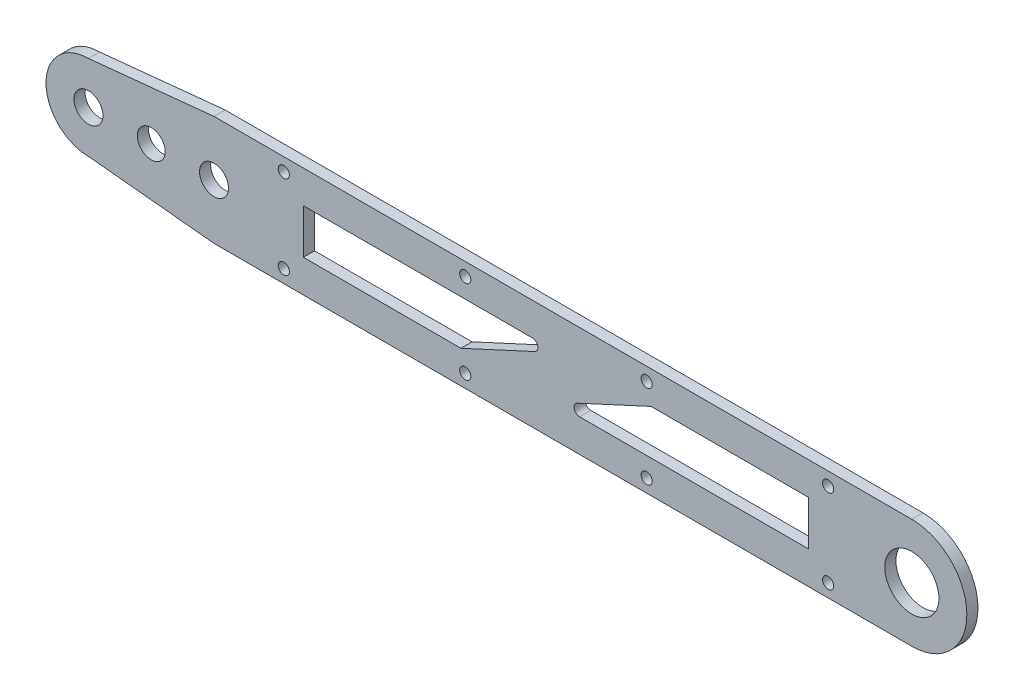
ISO-10303-21;
HEADER;
FILE_DESCRIPTION(('STEP AP214'),'2;1');
FILE_NAME('part.step','',(''),(''),'','','');
FILE_SCHEMA(('AUTOMOTIVE_DESIGN { 1 0 10303 214 1 1 1 1 }'));
ENDSEC;
DATA;
#1=APPLICATION_CONTEXT('core data for automotive mechanical design processes');
#2=APPLICATION_PROTOCOL_DEFINITION('international standard','automotive_design',2000,#1);
#3=PRODUCT_CONTEXT('',#1,'mechanical');
#4=PRODUCT('Part','Part','',(#3));
#5=PRODUCT_RELATED_PRODUCT_CATEGORY('part','',(#4));
#6=PRODUCT_DEFINITION_FORMATION('','',#4);
#7=PRODUCT_DEFINITION_CONTEXT('part definition',#1,'design');
#8=PRODUCT_DEFINITION('design','',#6,#7);
#9=PRODUCT_DEFINITION_SHAPE('','',#8);
#10=(LENGTH_UNIT() NAMED_UNIT(*) SI_UNIT(.MILLI.,.METRE.));
#11=(NAMED_UNIT(*) PLANE_ANGLE_UNIT() SI_UNIT($,.RADIAN.));
#12=(NAMED_UNIT(*) SI_UNIT($,.STERADIAN.) SOLID_ANGLE_UNIT());
#13=UNCERTAINTY_MEASURE_WITH_UNIT(LENGTH_MEASURE(1.E-05),#10,'distance_accuracy_value','');
#14=(GEOMETRIC_REPRESENTATION_CONTEXT(3) GLOBAL_UNCERTAINTY_ASSIGNED_CONTEXT((#13)) GLOBAL_UNIT_ASSIGNED_CONTEXT((#10,
#11,#12)) REPRESENTATION_CONTEXT('',''));
#15=CARTESIAN_POINT('',(0.,0.,0.));
#16=DIRECTION('',(0.,0.,1.));
#17=DIRECTION('',(1.,0.,0.));
#18=AXIS2_PLACEMENT_3D('',#15,#16,#17);
#19=CARTESIAN_POINT('',(-45.,0.,4.));
#20=DIRECTION('',(0.,0.,-1.));
#21=DIRECTION('',(-1.,0.,0.));
#22=AXIS2_PLACEMENT_3D('',#19,#20,#21);
#23=PLANE('',#22);
#24=DIRECTION('',(1.,0.,0.));
#25=VECTOR('',#24,1.);
#26=CARTESIAN_POINT('',(213.,-8.,4.));
#27=LINE('',#26,#25);
#28=CARTESIAN_POINT('',(130.976731594915,-8.,4.));
#29=VERTEX_POINT('',#28);
#30=CARTESIAN_POINT('',(213.,-8.,4.));
#31=VERTEX_POINT('',#30);
#32=EDGE_CURVE('E170',#29,#31,#27,.T.);
#33=ORIENTED_EDGE('',*,*,#32,.F.);
#34=CARTESIAN_POINT('',(130.976731594915,-6.,4.));
#35=DIRECTION('',(0.,0.,1.));
#36=DIRECTION('',(-1.,0.,0.));
#37=AXIS2_PLACEMENT_3D('',#34,#35,#36);
#38=CIRCLE('',#37,2.);
#39=CARTESIAN_POINT('',(130.138615239991,-4.18408123099903,4.));
#40=VERTEX_POINT('',#39);
#41=EDGE_CURVE('E55',#40,#29,#38,.T.);
#42=ORIENTED_EDGE('',*,*,#41,.F.);
#43=DIRECTION('',(-0.907959384500451,-0.419058177461749,0.));
#44=VECTOR('',#43,1.);
#45=CARTESIAN_POINT('',(130.138615239991,-4.18408123099903,4.));
#46=LINE('',#45,#44);
#47=CARTESIAN_POINT('',(156.537457907156,8.,4.));
#48=VERTEX_POINT('',#47);
#49=EDGE_CURVE('E182',#48,#40,#46,.T.);
#50=ORIENTED_EDGE('',*,*,#49,.F.);
#51=DIRECTION('',(-1.,0.,0.));
#52=VECTOR('',#51,1.);
#53=CARTESIAN_POINT('',(156.537457907156,8.,4.));
#54=LINE('',#53,#52);
#55=CARTESIAN_POINT('',(213.,8.,4.));
#56=VERTEX_POINT('',#55);
#57=EDGE_CURVE('E178',#56,#48,#54,.T.);
#58=ORIENTED_EDGE('',*,*,#57,.F.);
#59=DIRECTION('',(0.,1.,0.));
#60=VECTOR('',#59,1.);
#61=CARTESIAN_POINT('',(213.,8.,4.));
#62=LINE('',#61,#60);
#63=EDGE_CURVE('E159',#31,#56,#62,.T.);
#64=ORIENTED_EDGE('',*,*,#63,.F.);
#65=EDGE_LOOP('',(#33,#42,#50,#58,#64));
#66=FACE_BOUND('',#65,.T.);
#67=DIRECTION('',(0.,-1.,0.));
#68=VECTOR('',#67,1.);
#69=CARTESIAN_POINT('',(32.,8.,4.));
#70=LINE('',#69,#68);
#71=CARTESIAN_POINT('',(32.,8.,4.));
#72=VERTEX_POINT('',#71);
#73=CARTESIAN_POINT('',(32.,-8.,4.));
#74=VERTEX_POINT('',#73);
#75=EDGE_CURVE('E202',#72,#74,#70,.T.);
#76=ORIENTED_EDGE('',*,*,#75,.F.);
#77=DIRECTION('',(-1.,0.,0.));
#78=VECTOR('',#77,1.);
#79=CARTESIAN_POINT('',(114.023268405085,8.,4.));
#80=LINE('',#79,#78);
#81=CARTESIAN_POINT('',(114.023268405085,8.,4.));
#82=VERTEX_POINT('',#81);
#83=EDGE_CURVE('E63',#82,#72,#80,.T.);
#84=ORIENTED_EDGE('',*,*,#83,.F.);
#85=CARTESIAN_POINT('',(114.023268405086,6.,4.));
#86=DIRECTION('',(0.,0.,1.));
#87=DIRECTION('',(1.,0.,0.));
#88=AXIS2_PLACEMENT_3D('',#85,#86,#87);
#89=CIRCLE('',#88,2.);
#90=CARTESIAN_POINT('',(114.861384760009,4.18408123099903,4.));
#91=VERTEX_POINT('',#90);
#92=EDGE_CURVE('E215',#91,#82,#89,.T.);
#93=ORIENTED_EDGE('',*,*,#92,.F.);
#94=DIRECTION('',(0.907959384500451,0.419058177461749,0.));
#95=VECTOR('',#94,1.);
#96=CARTESIAN_POINT('',(88.4625420928446,-8.,4.));
#97=LINE('',#96,#95);
#98=CARTESIAN_POINT('',(88.4625420928446,-8.,4.));
#99=VERTEX_POINT('',#98);
#100=EDGE_CURVE('E211',#99,#91,#97,.T.);
#101=ORIENTED_EDGE('',*,*,#100,.F.);
#102=DIRECTION('',(1.,0.,0.));
#103=VECTOR('',#102,1.);
#104=CARTESIAN_POINT('',(32.,-8.,4.));
#105=LINE('',#104,#103);
#106=EDGE_CURVE('E207',#74,#99,#105,.T.);
#107=ORIENTED_EDGE('',*,*,#106,.F.);
#108=EDGE_LOOP('',(#76,#84,#93,#101,#107));
#109=FACE_BOUND('',#108,.T.);
#110=CARTESIAN_POINT('',(-22.5,0.,4.));
#111=DIRECTION('',(0.,0.,1.));
#112=DIRECTION('',(1.,0.,0.));
#113=AXIS2_PLACEMENT_3D('',#110,#111,#112);
#114=CIRCLE('',#113,5.);
#115=CARTESIAN_POINT('',(-17.5,0.,4.));
#116=VERTEX_POINT('',#115);
#117=EDGE_CURVE('E203',#116,#116,#114,.T.);
#118=ORIENTED_EDGE('',*,*,#117,.F.);
#119=EDGE_LOOP('',(#118));
#120=FACE_BOUND('',#119,.T.);
#121=CARTESIAN_POINT('',(90.0000000000003,-15.,4.));
#122=DIRECTION('',(0.,0.,1.));
#123=DIRECTION('',(1.,0.,0.));
#124=AXIS2_PLACEMENT_3D('',#121,#122,#123);
#125=CIRCLE('',#124,2.);
#126=CARTESIAN_POINT('',(92.0000000000003,-15.,4.));
#127=VERTEX_POINT('',#126);
#128=EDGE_CURVE('E241',#127,#127,#125,.T.);
#129=ORIENTED_EDGE('',*,*,#128,.F.);
#130=EDGE_LOOP('',(#129));
#131=FACE_BOUND('',#130,.T.);
#132=CARTESIAN_POINT('',(220.,15.,4.));
#133=DIRECTION('',(0.,0.,1.));
#134=DIRECTION('',(1.,0.,0.));
#135=AXIS2_PLACEMENT_3D('',#132,#133,#134);
#136=CIRCLE('',#135,2.);
#137=CARTESIAN_POINT('',(222.,15.,4.));
#138=VERTEX_POINT('',#137);
#139=EDGE_CURVE('E250',#138,#138,#136,.T.);
#140=ORIENTED_EDGE('',*,*,#139,.F.);
#141=EDGE_LOOP('',(#140));
#142=FACE_BOUND('',#141,.T.);
#143=CARTESIAN_POINT('',(155.,15.,4.));
#144=DIRECTION('',(0.,0.,1.));
#145=DIRECTION('',(1.,0.,0.));
#146=AXIS2_PLACEMENT_3D('',#143,#144,#145);
#147=CIRCLE('',#146,2.);
#148=CARTESIAN_POINT('',(157.,15.,4.));
#149=VERTEX_POINT('',#148);
#150=EDGE_CURVE('E254',#149,#149,#147,.T.);
#151=ORIENTED_EDGE('',*,*,#150,.F.);
#152=EDGE_LOOP('',(#151));
#153=FACE_BOUND('',#152,.T.);
#154=CARTESIAN_POINT('',(90.,15.,4.));
#155=DIRECTION('',(0.,0.,1.));
#156=DIRECTION('',(1.,0.,0.));
#157=AXIS2_PLACEMENT_3D('',#154,#155,#156);
#158=CIRCLE('',#157,2.);
#159=CARTESIAN_POINT('',(92.,15.,4.));
#160=VERTEX_POINT('',#159);
#161=EDGE_CURVE('E258',#160,#160,#158,.T.);
#162=ORIENTED_EDGE('',*,*,#161,.F.);
#163=EDGE_LOOP('',(#162));
#164=FACE_BOUND('',#163,.T.);
#165=CARTESIAN_POINT('',(155.,-15.,4.));
#166=DIRECTION('',(0.,0.,1.));
#167=DIRECTION('',(1.,0.,0.));
#168=AXIS2_PLACEMENT_3D('',#165,#166,#167);
#169=CIRCLE('',#168,2.);
#170=CARTESIAN_POINT('',(157.,-15.,4.));
#171=VERTEX_POINT('',#170);
#172=EDGE_CURVE('E237',#171,#171,#169,.T.);
#173=ORIENTED_EDGE('',*,*,#172,.F.);
#174=EDGE_LOOP('',(#173));
#175=FACE_BOUND('',#174,.T.);
#176=CARTESIAN_POINT('',(220.,-15.,4.));
#177=DIRECTION('',(0.,0.,1.));
#178=DIRECTION('',(1.,0.,0.));
#179=AXIS2_PLACEMENT_3D('',#176,#177,#178);
#180=CIRCLE('',#179,2.);
#181=CARTESIAN_POINT('',(222.,-15.,4.));
#182=VERTEX_POINT('',#181);
#183=EDGE_CURVE('E242',#182,#182,#180,.T.);
#184=ORIENTED_EDGE('',*,*,#183,.F.);
#185=EDGE_LOOP('',(#184));
#186=FACE_BOUND('',#185,.T.);
#187=CARTESIAN_POINT('',(25.0000000000003,-15.,4.));
#188=DIRECTION('',(0.,0.,1.));
#189=DIRECTION('',(1.,0.,0.));
#190=AXIS2_PLACEMENT_3D('',#187,#188,#189);
#191=CIRCLE('',#190,2.);
#192=CARTESIAN_POINT('',(27.0000000000003,-15.,4.));
#193=VERTEX_POINT('',#192);
#194=EDGE_CURVE('E246',#193,#193,#191,.T.);
#195=ORIENTED_EDGE('',*,*,#194,.F.);
#196=EDGE_LOOP('',(#195));
#197=FACE_BOUND('',#196,.T.);
#198=CARTESIAN_POINT('',(25.,15.,4.));
#199=DIRECTION('',(0.,0.,1.));
#200=DIRECTION('',(1.,0.,0.));
#201=AXIS2_PLACEMENT_3D('',#198,#199,#200);
#202=CIRCLE('',#201,2.);
#203=CARTESIAN_POINT('',(27.,15.,4.));
#204=VERTEX_POINT('',#203);
#205=EDGE_CURVE('E262',#204,#204,#202,.T.);
#206=ORIENTED_EDGE('',*,*,#205,.F.);
#207=EDGE_LOOP('',(#206));
#208=FACE_BOUND('',#207,.T.);
#209=CARTESIAN_POINT('',(-45.,0.,4.));
#210=DIRECTION('',(0.,0.,1.));
#211=DIRECTION('',(-1.,0.,0.));
#212=AXIS2_PLACEMENT_3D('',#209,#210,#211);
#213=CIRCLE('',#212,15.2);
#214=CARTESIAN_POINT('',(-45.,15.2,4.));
#215=VERTEX_POINT('',#214);
#216=CARTESIAN_POINT('',(-45.,-15.2,4.));
#217=VERTEX_POINT('',#216);
#218=EDGE_CURVE('E296',#215,#217,#213,.T.);
#219=ORIENTED_EDGE('',*,*,#218,.T.);
#220=DIRECTION('',(0.995037190209989,-0.0995037190209987,0.));
#221=VECTOR('',#220,1.);
#222=CARTESIAN_POINT('',(-45.,-15.2,4.));
#223=LINE('',#222,#221);
#224=CARTESIAN_POINT('',(0.,-19.7,4.));
#225=VERTEX_POINT('',#224);
#226=EDGE_CURVE('E300',#217,#225,#223,.T.);
#227=ORIENTED_EDGE('',*,*,#226,.T.);
#228=DIRECTION('',(1.,0.,0.));
#229=VECTOR('',#228,1.);
#230=CARTESIAN_POINT('',(0.,-19.7,4.));
#231=LINE('',#230,#229);
#232=CARTESIAN_POINT('',(250.,-19.7,4.));
#233=VERTEX_POINT('',#232);
#234=EDGE_CURVE('E304',#225,#233,#231,.T.);
#235=ORIENTED_EDGE('',*,*,#234,.T.);
#236=CARTESIAN_POINT('',(250.,0.,4.));
#237=DIRECTION('',(0.,0.,1.));
#238=DIRECTION('',(1.,0.,0.));
#239=AXIS2_PLACEMENT_3D('',#236,#237,#238);
#240=CIRCLE('',#239,19.7);
#241=CARTESIAN_POINT('',(250.,19.7,4.));
#242=VERTEX_POINT('',#241);
#243=EDGE_CURVE('E307',#233,#242,#240,.T.);
#244=ORIENTED_EDGE('',*,*,#243,.T.);
#245=DIRECTION('',(-1.,0.,0.));
#246=VECTOR('',#245,1.);
#247=CARTESIAN_POINT('',(250.,19.7,4.));
#248=LINE('',#247,#246);
#249=CARTESIAN_POINT('',(0.,19.7,4.));
#250=VERTEX_POINT('',#249);
#251=EDGE_CURVE('E310',#242,#250,#248,.T.);
#252=ORIENTED_EDGE('',*,*,#251,.T.);
#253=DIRECTION('',(-0.995037190209989,-0.099503719020999,0.));
#254=VECTOR('',#253,1.);
#255=CARTESIAN_POINT('',(0.,19.7,4.));
#256=LINE('',#255,#254);
#257=EDGE_CURVE('E313',#250,#215,#256,.T.);
#258=ORIENTED_EDGE('',*,*,#257,.T.);
#259=EDGE_LOOP('',(#219,#227,#235,#244,#252,#258));
#260=FACE_BOUND('',#259,.T.);
#261=CARTESIAN_POINT('',(0.,0.,4.));
#262=DIRECTION('',(0.,0.,1.));
#263=DIRECTION('',(1.,0.,0.));
#264=AXIS2_PLACEMENT_3D('',#261,#262,#263);
#265=CIRCLE('',#264,5.2);
#266=CARTESIAN_POINT('',(5.2,0.,4.));
#267=VERTEX_POINT('',#266);
#268=EDGE_CURVE('E288',#267,#267,#265,.T.);
#269=ORIENTED_EDGE('',*,*,#268,.F.);
#270=EDGE_LOOP('',(#269));
#271=FACE_BOUND('',#270,.T.);
#272=CARTESIAN_POINT('',(250.,0.,4.));
#273=DIRECTION('',(0.,0.,1.));
#274=DIRECTION('',(1.,0.,0.));
#275=AXIS2_PLACEMENT_3D('',#272,#273,#274);
#276=CIRCLE('',#275,9.7);
#277=CARTESIAN_POINT('',(259.7,0.,4.));
#278=VERTEX_POINT('',#277);
#279=EDGE_CURVE('E280',#278,#278,#276,.T.);
#280=ORIENTED_EDGE('',*,*,#279,.F.);
#281=EDGE_LOOP('',(#280));
#282=FACE_BOUND('',#281,.T.);
#283=CARTESIAN_POINT('',(-45.,0.,4.));
#284=DIRECTION('',(0.,0.,1.));
#285=DIRECTION('',(1.,0.,0.));
#286=AXIS2_PLACEMENT_3D('',#283,#284,#285);
#287=CIRCLE('',#286,5.20000000000001);
#288=CARTESIAN_POINT('',(-39.8,0.,4.));
#289=VERTEX_POINT('',#288);
#290=EDGE_CURVE('E270',#289,#289,#287,.T.);
#291=ORIENTED_EDGE('',*,*,#290,.F.);
#292=EDGE_LOOP('',(#291));
#293=FACE_BOUND('',#292,.T.);
#294=ADVANCED_FACE('F39',(#66,#109,#120,#131,#142,#153,#164,#175,#186,#197,#208,#260,#271,#282,
#293),#23,.F.);
#295=CARTESIAN_POINT('',(-45.,0.,0.));
#296=DIRECTION('',(0.,0.,-1.));
#297=DIRECTION('',(-1.,0.,0.));
#298=AXIS2_PLACEMENT_3D('',#295,#296,#297);
#299=PLANE('',#298);
#300=CARTESIAN_POINT('',(130.976731594915,-6.,0.));
#301=DIRECTION('',(0.,0.,-1.));
#302=DIRECTION('',(-1.,0.,0.));
#303=AXIS2_PLACEMENT_3D('',#300,#301,#302);
#304=CIRCLE('',#303,2.);
#305=CARTESIAN_POINT('',(130.976731594915,-8.,0.));
#306=VERTEX_POINT('',#305);
#307=CARTESIAN_POINT('',(130.138615239991,-4.18408123099903,0.));
#308=VERTEX_POINT('',#307);
#309=EDGE_CURVE('E11',#306,#308,#304,.T.);
#310=ORIENTED_EDGE('',*,*,#309,.F.);
#311=DIRECTION('',(-1.,0.,0.));
#312=VECTOR('',#311,1.);
#313=CARTESIAN_POINT('',(-45.,-8.,0.));
#314=LINE('',#313,#312);
#315=CARTESIAN_POINT('',(213.,-8.,0.));
#316=VERTEX_POINT('',#315);
#317=EDGE_CURVE('E406',#316,#306,#314,.T.);
#318=ORIENTED_EDGE('',*,*,#317,.F.);
#319=DIRECTION('',(0.,-1.,0.));
#320=VECTOR('',#319,1.);
#321=CARTESIAN_POINT('',(213.,0.,0.));
#322=LINE('',#321,#320);
#323=CARTESIAN_POINT('',(213.,8.,0.));
#324=VERTEX_POINT('',#323);
#325=EDGE_CURVE('E162',#324,#316,#322,.T.);
#326=ORIENTED_EDGE('',*,*,#325,.F.);
#327=DIRECTION('',(1.,0.,0.));
#328=VECTOR('',#327,1.);
#329=CARTESIAN_POINT('',(-45.,8.,0.));
#330=LINE('',#329,#328);
#331=CARTESIAN_POINT('',(156.537457907156,8.,0.));
#332=VERTEX_POINT('',#331);
#333=EDGE_CURVE('E411',#332,#324,#330,.T.);
#334=ORIENTED_EDGE('',*,*,#333,.F.);
#335=DIRECTION('',(0.907959384500451,0.419058177461749,0.));
#336=VECTOR('',#335,1.);
#337=CARTESIAN_POINT('',(-12.651958611426,-70.0874230085766,0.));
#338=LINE('',#337,#336);
#339=EDGE_CURVE('E48',#308,#332,#338,.T.);
#340=ORIENTED_EDGE('',*,*,#339,.F.);
#341=EDGE_LOOP('',(#310,#318,#326,#334,#340));
#342=FACE_BOUND('',#341,.T.);
#343=DIRECTION('',(1.,0.,0.));
#344=VECTOR('',#343,1.);
#345=CARTESIAN_POINT('',(-45.,8.,0.));
#346=LINE('',#345,#344);
#347=CARTESIAN_POINT('',(32.,8.,0.));
#348=VERTEX_POINT('',#347);
#349=CARTESIAN_POINT('',(114.023268405085,8.,0.));
#350=VERTEX_POINT('',#349);
#351=EDGE_CURVE('E403',#348,#350,#346,.T.);
#352=ORIENTED_EDGE('',*,*,#351,.F.);
#353=DIRECTION('',(0.,1.,0.));
#354=VECTOR('',#353,1.);
#355=CARTESIAN_POINT('',(32.,0.,0.));
#356=LINE('',#355,#354);
#357=CARTESIAN_POINT('',(32.,-8.,0.));
#358=VERTEX_POINT('',#357);
#359=EDGE_CURVE('E357',#358,#348,#356,.T.);
#360=ORIENTED_EDGE('',*,*,#359,.F.);
#361=DIRECTION('',(-1.,0.,0.));
#362=VECTOR('',#361,1.);
#363=CARTESIAN_POINT('',(-45.,-8.,0.));
#364=LINE('',#363,#362);
#365=CARTESIAN_POINT('',(88.4625420928446,-8.,0.));
#366=VERTEX_POINT('',#365);
#367=EDGE_CURVE('E393',#366,#358,#364,.T.);
#368=ORIENTED_EDGE('',*,*,#367,.F.);
#369=DIRECTION('',(-0.907959384500451,-0.419058177461749,0.));
#370=VECTOR('',#369,1.);
#371=CARTESIAN_POINT('',(-18.5187730958905,-57.3759916255703,0.));
#372=LINE('',#371,#370);
#373=CARTESIAN_POINT('',(114.861384760009,4.18408123099903,0.));
#374=VERTEX_POINT('',#373);
#375=EDGE_CURVE('E397',#374,#366,#372,.T.);
#376=ORIENTED_EDGE('',*,*,#375,.F.);
#377=CARTESIAN_POINT('',(114.023268405086,6.,0.));
#378=DIRECTION('',(0.,0.,-1.));
#379=DIRECTION('',(-1.,0.,0.));
#380=AXIS2_PLACEMENT_3D('',#377,#378,#379);
#381=CIRCLE('',#380,2.);
#382=EDGE_CURVE('E400',#350,#374,#381,.T.);
#383=ORIENTED_EDGE('',*,*,#382,.F.);
#384=EDGE_LOOP('',(#352,#360,#368,#376,#383));
#385=FACE_BOUND('',#384,.T.);
#386=CARTESIAN_POINT('',(-22.5,0.,0.));
#387=DIRECTION('',(0.,0.,-1.));
#388=DIRECTION('',(-1.,0.,0.));
#389=AXIS2_PLACEMENT_3D('',#386,#387,#388);
#390=CIRCLE('',#389,5.);
#391=CARTESIAN_POINT('',(-27.5,0.,0.));
#392=VERTEX_POINT('',#391);
#393=EDGE_CURVE('E192',#392,#392,#390,.T.);
#394=ORIENTED_EDGE('',*,*,#393,.F.);
#395=EDGE_LOOP('',(#394));
#396=FACE_BOUND('',#395,.T.);
#397=CARTESIAN_POINT('',(90.0000000000003,-15.,0.));
#398=DIRECTION('',(0.,0.,-1.));
#399=DIRECTION('',(-1.,0.,0.));
#400=AXIS2_PLACEMENT_3D('',#397,#398,#399);
#401=CIRCLE('',#400,2.);
#402=CARTESIAN_POINT('',(88.0000000000003,-15.,0.));
#403=VERTEX_POINT('',#402);
#404=EDGE_CURVE('E279',#403,#403,#401,.T.);
#405=ORIENTED_EDGE('',*,*,#404,.F.);
#406=EDGE_LOOP('',(#405));
#407=FACE_BOUND('',#406,.T.);
#408=CARTESIAN_POINT('',(220.,15.,0.));
#409=DIRECTION('',(0.,0.,-1.));
#410=DIRECTION('',(-1.,0.,0.));
#411=AXIS2_PLACEMENT_3D('',#408,#409,#410);
#412=CIRCLE('',#411,2.);
#413=CARTESIAN_POINT('',(218.,15.,0.));
#414=VERTEX_POINT('',#413);
#415=EDGE_CURVE('E381',#414,#414,#412,.T.);
#416=ORIENTED_EDGE('',*,*,#415,.F.);
#417=EDGE_LOOP('',(#416));
#418=FACE_BOUND('',#417,.T.);
#419=CARTESIAN_POINT('',(155.,15.,0.));
#420=DIRECTION('',(0.,0.,-1.));
#421=DIRECTION('',(-1.,0.,0.));
#422=AXIS2_PLACEMENT_3D('',#419,#420,#421);
#423=CIRCLE('',#422,2.);
#424=CARTESIAN_POINT('',(153.,15.,0.));
#425=VERTEX_POINT('',#424);
#426=EDGE_CURVE('E377',#425,#425,#423,.T.);
#427=ORIENTED_EDGE('',*,*,#426,.F.);
#428=EDGE_LOOP('',(#427));
#429=FACE_BOUND('',#428,.T.);
#430=CARTESIAN_POINT('',(90.,15.,0.));
#431=DIRECTION('',(0.,0.,-1.));
#432=DIRECTION('',(-1.,0.,0.));
#433=AXIS2_PLACEMENT_3D('',#430,#431,#432);
#434=CIRCLE('',#433,2.);
#435=CARTESIAN_POINT('',(88.,15.,0.));
#436=VERTEX_POINT('',#435);
#437=EDGE_CURVE('E373',#436,#436,#434,.T.);
#438=ORIENTED_EDGE('',*,*,#437,.F.);
#439=EDGE_LOOP('',(#438));
#440=FACE_BOUND('',#439,.T.);
#441=CARTESIAN_POINT('',(155.,-15.,0.));
#442=DIRECTION('',(0.,0.,-1.));
#443=DIRECTION('',(-1.,0.,0.));
#444=AXIS2_PLACEMENT_3D('',#441,#442,#443);
#445=CIRCLE('',#444,2.);
#446=CARTESIAN_POINT('',(153.,-15.,0.));
#447=VERTEX_POINT('',#446);
#448=EDGE_CURVE('E369',#447,#447,#445,.T.);
#449=ORIENTED_EDGE('',*,*,#448,.F.);
#450=EDGE_LOOP('',(#449));
#451=FACE_BOUND('',#450,.T.);
#452=CARTESIAN_POINT('',(220.,-15.,0.));
#453=DIRECTION('',(0.,0.,-1.));
#454=DIRECTION('',(-1.,0.,0.));
#455=AXIS2_PLACEMENT_3D('',#452,#453,#454);
#456=CIRCLE('',#455,2.);
#457=CARTESIAN_POINT('',(218.,-15.,0.));
#458=VERTEX_POINT('',#457);
#459=EDGE_CURVE('E365',#458,#458,#456,.T.);
#460=ORIENTED_EDGE('',*,*,#459,.F.);
#461=EDGE_LOOP('',(#460));
#462=FACE_BOUND('',#461,.T.);
#463=CARTESIAN_POINT('',(25.0000000000003,-15.,0.));
#464=DIRECTION('',(0.,0.,-1.));
#465=DIRECTION('',(-1.,0.,0.));
#466=AXIS2_PLACEMENT_3D('',#463,#464,#465);
#467=CIRCLE('',#466,2.);
#468=CARTESIAN_POINT('',(23.0000000000003,-15.,0.));
#469=VERTEX_POINT('',#468);
#470=EDGE_CURVE('E361',#469,#469,#467,.T.);
#471=ORIENTED_EDGE('',*,*,#470,.F.);
#472=EDGE_LOOP('',(#471));
#473=FACE_BOUND('',#472,.T.);
#474=CARTESIAN_POINT('',(25.,15.,0.));
#475=DIRECTION('',(0.,0.,-1.));
#476=DIRECTION('',(-1.,0.,0.));
#477=AXIS2_PLACEMENT_3D('',#474,#475,#476);
#478=CIRCLE('',#477,2.);
#479=CARTESIAN_POINT('',(23.,15.,0.));
#480=VERTEX_POINT('',#479);
#481=EDGE_CURVE('E269',#480,#480,#478,.T.);
#482=ORIENTED_EDGE('',*,*,#481,.F.);
#483=EDGE_LOOP('',(#482));
#484=FACE_BOUND('',#483,.T.);
#485=CARTESIAN_POINT('',(250.,0.,0.));
#486=DIRECTION('',(0.,0.,1.));
#487=DIRECTION('',(1.,0.,0.));
#488=AXIS2_PLACEMENT_3D('',#485,#486,#487);
#489=CIRCLE('',#488,9.7);
#490=CARTESIAN_POINT('',(259.7,0.,0.));
#491=VERTEX_POINT('',#490);
#492=EDGE_CURVE('E274',#491,#491,#489,.T.);
#493=ORIENTED_EDGE('',*,*,#492,.T.);
#494=EDGE_LOOP('',(#493));
#495=FACE_BOUND('',#494,.T.);
#496=CARTESIAN_POINT('',(-45.,0.,0.));
#497=DIRECTION('',(0.,0.,1.));
#498=DIRECTION('',(-1.,0.,0.));
#499=AXIS2_PLACEMENT_3D('',#496,#497,#498);
#500=CIRCLE('',#499,15.2);
#501=CARTESIAN_POINT('',(-45.,15.2,0.));
#502=VERTEX_POINT('',#501);
#503=CARTESIAN_POINT('',(-45.,-15.2,0.));
#504=VERTEX_POINT('',#503);
#505=EDGE_CURVE('E292',#502,#504,#500,.T.);
#506=ORIENTED_EDGE('',*,*,#505,.F.);
#507=DIRECTION('',(-0.995037190209989,-0.099503719020999,0.));
#508=VECTOR('',#507,1.);
#509=CARTESIAN_POINT('',(0.,19.7,0.));
#510=LINE('',#509,#508);
#511=CARTESIAN_POINT('',(0.,19.7,0.));
#512=VERTEX_POINT('',#511);
#513=EDGE_CURVE('E301',#512,#502,#510,.T.);
#514=ORIENTED_EDGE('',*,*,#513,.F.);
#515=DIRECTION('',(-1.,0.,0.));
#516=VECTOR('',#515,1.);
#517=CARTESIAN_POINT('',(250.,19.7,0.));
#518=LINE('',#517,#516);
#519=CARTESIAN_POINT('',(250.,19.7,0.));
#520=VERTEX_POINT('',#519);
#521=EDGE_CURVE('E329',#520,#512,#518,.T.);
#522=ORIENTED_EDGE('',*,*,#521,.F.);
#523=CARTESIAN_POINT('',(250.,0.,0.));
#524=DIRECTION('',(0.,0.,1.));
#525=DIRECTION('',(1.,0.,0.));
#526=AXIS2_PLACEMENT_3D('',#523,#524,#525);
#527=CIRCLE('',#526,19.7);
#528=CARTESIAN_POINT('',(250.,-19.7,0.));
#529=VERTEX_POINT('',#528);
#530=EDGE_CURVE('E326',#529,#520,#527,.T.);
#531=ORIENTED_EDGE('',*,*,#530,.F.);
#532=DIRECTION('',(1.,0.,0.));
#533=VECTOR('',#532,1.);
#534=CARTESIAN_POINT('',(0.,-19.7,0.));
#535=LINE('',#534,#533);
#536=CARTESIAN_POINT('',(0.,-19.7,0.));
#537=VERTEX_POINT('',#536);
#538=EDGE_CURVE('E323',#537,#529,#535,.T.);
#539=ORIENTED_EDGE('',*,*,#538,.F.);
#540=DIRECTION('',(0.995037190209989,-0.0995037190209987,0.));
#541=VECTOR('',#540,1.);
#542=CARTESIAN_POINT('',(-45.,-15.2,0.));
#543=LINE('',#542,#541);
#544=EDGE_CURVE('E320',#504,#537,#543,.T.);
#545=ORIENTED_EDGE('',*,*,#544,.F.);
#546=EDGE_LOOP('',(#506,#514,#522,#531,#539,#545));
#547=FACE_BOUND('',#546,.T.);
#548=CARTESIAN_POINT('',(0.,0.,0.));
#549=DIRECTION('',(0.,0.,1.));
#550=DIRECTION('',(1.,0.,0.));
#551=AXIS2_PLACEMENT_3D('',#548,#549,#550);
#552=CIRCLE('',#551,5.2);
#553=CARTESIAN_POINT('',(5.2,0.,0.));
#554=VERTEX_POINT('',#553);
#555=EDGE_CURVE('E284',#554,#554,#552,.T.);
#556=ORIENTED_EDGE('',*,*,#555,.T.);
#557=EDGE_LOOP('',(#556));
#558=FACE_BOUND('',#557,.T.);
#559=CARTESIAN_POINT('',(-45.,0.,0.));
#560=DIRECTION('',(0.,0.,1.));
#561=DIRECTION('',(1.,0.,0.));
#562=AXIS2_PLACEMENT_3D('',#559,#560,#561);
#563=CIRCLE('',#562,5.20000000000001);
#564=CARTESIAN_POINT('',(-39.8,0.,0.));
#565=VERTEX_POINT('',#564);
#566=EDGE_CURVE('E275',#565,#565,#563,.T.);
#567=ORIENTED_EDGE('',*,*,#566,.T.);
#568=EDGE_LOOP('',(#567));
#569=FACE_BOUND('',#568,.T.);
#570=ADVANCED_FACE('F424',(#342,#385,#396,#407,#418,#429,#440,#451,#462,#473,#484,#495,#547,
#558,#569),#299,.T.);
#571=CARTESIAN_POINT('',(-45.,0.,4.));
#572=DIRECTION('',(0.,0.,-1.));
#573=DIRECTION('',(-1.,0.,0.));
#574=AXIS2_PLACEMENT_3D('',#571,#572,#573);
#575=CYLINDRICAL_SURFACE('',#574,15.2);
#576=ORIENTED_EDGE('',*,*,#505,.T.);
#577=DIRECTION('',(0.,0.,-1.));
#578=VECTOR('',#577,1.);
#579=CARTESIAN_POINT('',(-45.,-15.2,4.));
#580=LINE('',#579,#578);
#581=EDGE_CURVE('E353',#217,#504,#580,.T.);
#582=ORIENTED_EDGE('',*,*,#581,.F.);
#583=ORIENTED_EDGE('',*,*,#218,.F.);
#584=DIRECTION('',(0.,0.,-1.));
#585=VECTOR('',#584,1.);
#586=CARTESIAN_POINT('',(-45.,15.2,4.));
#587=LINE('',#586,#585);
#588=EDGE_CURVE('E316',#215,#502,#587,.T.);
#589=ORIENTED_EDGE('',*,*,#588,.T.);
#590=EDGE_LOOP('',(#576,#582,#583,#589));
#591=FACE_BOUND('',#590,.T.);
#592=ADVANCED_FACE('F41',(#591),#575,.T.);
#593=CARTESIAN_POINT('',(-45.,-15.2,4.));
#594=DIRECTION('',(0.0995037190209987,0.995037190209989,0.));
#595=DIRECTION('',(-0.995037190209989,0.0995037190209987,0.));
#596=AXIS2_PLACEMENT_3D('',#593,#594,#595);
#597=PLANE('',#596);
#598=ORIENTED_EDGE('',*,*,#544,.T.);
#599=DIRECTION('',(0.,0.,-1.));
#600=VECTOR('',#599,1.);
#601=CARTESIAN_POINT('',(0.,-19.7,4.));
#602=LINE('',#601,#600);
#603=EDGE_CURVE('E349',#225,#537,#602,.T.);
#604=ORIENTED_EDGE('',*,*,#603,.F.);
#605=ORIENTED_EDGE('',*,*,#226,.F.);
#606=ORIENTED_EDGE('',*,*,#581,.T.);
#607=EDGE_LOOP('',(#598,#604,#605,#606));
#608=FACE_BOUND('',#607,.T.);
#609=ADVANCED_FACE('F465',(#608),#597,.F.);
#610=CARTESIAN_POINT('',(0.,-19.7,4.));
#611=DIRECTION('',(0.,1.,0.));
#612=DIRECTION('',(-1.,0.,0.));
#613=AXIS2_PLACEMENT_3D('',#610,#611,#612);
#614=PLANE('',#613);
#615=ORIENTED_EDGE('',*,*,#538,.T.);
#616=DIRECTION('',(0.,0.,-1.));
#617=VECTOR('',#616,1.);
#618=CARTESIAN_POINT('',(250.,-19.7,4.));
#619=LINE('',#618,#617);
#620=EDGE_CURVE('E345',#233,#529,#619,.T.);
#621=ORIENTED_EDGE('',*,*,#620,.F.);
#622=ORIENTED_EDGE('',*,*,#234,.F.);
#623=ORIENTED_EDGE('',*,*,#603,.T.);
#624=EDGE_LOOP('',(#615,#621,#622,#623));
#625=FACE_BOUND('',#624,.T.);
#626=ADVANCED_FACE('F462',(#625),#614,.F.);
#627=CARTESIAN_POINT('',(250.,0.,4.));
#628=DIRECTION('',(0.,0.,-1.));
#629=DIRECTION('',(-1.,0.,0.));
#630=AXIS2_PLACEMENT_3D('',#627,#628,#629);
#631=CYLINDRICAL_SURFACE('',#630,19.7);
#632=ORIENTED_EDGE('',*,*,#530,.T.);
#633=DIRECTION('',(0.,0.,-1.));
#634=VECTOR('',#633,1.);
#635=CARTESIAN_POINT('',(250.,19.7,4.));
#636=LINE('',#635,#634);
#637=EDGE_CURVE('E341',#242,#520,#636,.T.);
#638=ORIENTED_EDGE('',*,*,#637,.F.);
#639=ORIENTED_EDGE('',*,*,#243,.F.);
#640=ORIENTED_EDGE('',*,*,#620,.T.);
#641=EDGE_LOOP('',(#632,#638,#639,#640));
#642=FACE_BOUND('',#641,.T.);
#643=ADVANCED_FACE('F458',(#642),#631,.T.);
#644=CARTESIAN_POINT('',(250.,19.7,4.));
#645=DIRECTION('',(0.,-1.,0.));
#646=DIRECTION('',(1.,0.,0.));
#647=AXIS2_PLACEMENT_3D('',#644,#645,#646);
#648=PLANE('',#647);
#649=ORIENTED_EDGE('',*,*,#521,.T.);
#650=DIRECTION('',(0.,0.,-1.));
#651=VECTOR('',#650,1.);
#652=CARTESIAN_POINT('',(0.,19.7,4.));
#653=LINE('',#652,#651);
#654=EDGE_CURVE('E337',#250,#512,#653,.T.);
#655=ORIENTED_EDGE('',*,*,#654,.F.);
#656=ORIENTED_EDGE('',*,*,#251,.F.);
#657=ORIENTED_EDGE('',*,*,#637,.T.);
#658=EDGE_LOOP('',(#649,#655,#656,#657));
#659=FACE_BOUND('',#658,.T.);
#660=ADVANCED_FACE('F454',(#659),#648,.F.);
#661=CARTESIAN_POINT('',(0.,19.7,4.));
#662=DIRECTION('',(0.099503719020999,-0.995037190209989,0.));
#663=DIRECTION('',(0.995037190209989,0.099503719020999,0.));
#664=AXIS2_PLACEMENT_3D('',#661,#662,#663);
#665=PLANE('',#664);
#666=ORIENTED_EDGE('',*,*,#513,.T.);
#667=ORIENTED_EDGE('',*,*,#588,.F.);
#668=ORIENTED_EDGE('',*,*,#257,.F.);
#669=ORIENTED_EDGE('',*,*,#654,.T.);
#670=EDGE_LOOP('',(#666,#667,#668,#669));
#671=FACE_BOUND('',#670,.T.);
#672=ADVANCED_FACE('F451',(#671),#665,.F.);
#673=CARTESIAN_POINT('',(0.,0.,4.));
#674=DIRECTION('',(0.,0.,-1.));
#675=DIRECTION('',(-1.,0.,0.));
#676=AXIS2_PLACEMENT_3D('',#673,#674,#675);
#677=CYLINDRICAL_SURFACE('',#676,5.2);
#678=ORIENTED_EDGE('',*,*,#268,.T.);
#679=EDGE_LOOP('',(#678));
#680=FACE_BOUND('',#679,.T.);
#681=ORIENTED_EDGE('',*,*,#555,.F.);
#682=EDGE_LOOP('',(#681));
#683=FACE_BOUND('',#682,.T.);
#684=ADVANCED_FACE('F448',(#680,#683),#677,.F.);
#685=CARTESIAN_POINT('',(250.,0.,4.));
#686=DIRECTION('',(0.,0.,-1.));
#687=DIRECTION('',(-1.,0.,0.));
#688=AXIS2_PLACEMENT_3D('',#685,#686,#687);
#689=CYLINDRICAL_SURFACE('',#688,9.7);
#690=ORIENTED_EDGE('',*,*,#279,.T.);
#691=EDGE_LOOP('',(#690));
#692=FACE_BOUND('',#691,.T.);
#693=ORIENTED_EDGE('',*,*,#492,.F.);
#694=EDGE_LOOP('',(#693));
#695=FACE_BOUND('',#694,.T.);
#696=ADVANCED_FACE('F503',(#692,#695),#689,.F.);
#697=CARTESIAN_POINT('',(-45.,0.,4.));
#698=DIRECTION('',(0.,0.,-1.));
#699=DIRECTION('',(-1.,0.,0.));
#700=AXIS2_PLACEMENT_3D('',#697,#698,#699);
#701=CYLINDRICAL_SURFACE('',#700,5.20000000000001);
#702=ORIENTED_EDGE('',*,*,#290,.T.);
#703=EDGE_LOOP('',(#702));
#704=FACE_BOUND('',#703,.T.);
#705=ORIENTED_EDGE('',*,*,#566,.F.);
#706=EDGE_LOOP('',(#705));
#707=FACE_BOUND('',#706,.T.);
#708=ADVANCED_FACE('F499',(#704,#707),#701,.F.);
#709=CARTESIAN_POINT('',(25.,15.,-6.));
#710=DIRECTION('',(0.,0.,1.));
#711=DIRECTION('',(1.,0.,0.));
#712=AXIS2_PLACEMENT_3D('',#709,#710,#711);
#713=CYLINDRICAL_SURFACE('',#712,2.);
#714=ORIENTED_EDGE('',*,*,#481,.T.);
#715=EDGE_LOOP('',(#714));
#716=FACE_BOUND('',#715,.T.);
#717=ORIENTED_EDGE('',*,*,#205,.T.);
#718=EDGE_LOOP('',(#717));
#719=FACE_BOUND('',#718,.T.);
#720=ADVANCED_FACE('F502',(#716,#719),#713,.F.);
#721=CARTESIAN_POINT('',(25.0000000000003,-15.,-6.));
#722=DIRECTION('',(0.,0.,1.));
#723=DIRECTION('',(1.,0.,0.));
#724=AXIS2_PLACEMENT_3D('',#721,#722,#723);
#725=CYLINDRICAL_SURFACE('',#724,2.);
#726=ORIENTED_EDGE('',*,*,#470,.T.);
#727=EDGE_LOOP('',(#726));
#728=FACE_BOUND('',#727,.T.);
#729=ORIENTED_EDGE('',*,*,#194,.T.);
#730=EDGE_LOOP('',(#729));
#731=FACE_BOUND('',#730,.T.);
#732=ADVANCED_FACE('F511',(#728,#731),#725,.F.);
#733=CARTESIAN_POINT('',(220.,-15.,-6.));
#734=DIRECTION('',(0.,0.,1.));
#735=DIRECTION('',(1.,0.,0.));
#736=AXIS2_PLACEMENT_3D('',#733,#734,#735);
#737=CYLINDRICAL_SURFACE('',#736,2.);
#738=ORIENTED_EDGE('',*,*,#459,.T.);
#739=EDGE_LOOP('',(#738));
#740=FACE_BOUND('',#739,.T.);
#741=ORIENTED_EDGE('',*,*,#183,.T.);
#742=EDGE_LOOP('',(#741));
#743=FACE_BOUND('',#742,.T.);
#744=ADVANCED_FACE('F536',(#740,#743),#737,.F.);
#745=CARTESIAN_POINT('',(155.,-15.,-6.));
#746=DIRECTION('',(0.,0.,1.));
#747=DIRECTION('',(1.,0.,0.));
#748=AXIS2_PLACEMENT_3D('',#745,#746,#747);
#749=CYLINDRICAL_SURFACE('',#748,2.);
#750=ORIENTED_EDGE('',*,*,#448,.T.);
#751=EDGE_LOOP('',(#750));
#752=FACE_BOUND('',#751,.T.);
#753=ORIENTED_EDGE('',*,*,#172,.T.);
#754=EDGE_LOOP('',(#753));
#755=FACE_BOUND('',#754,.T.);
#756=ADVANCED_FACE('F524',(#752,#755),#749,.F.);
#757=CARTESIAN_POINT('',(90.,15.,-6.));
#758=DIRECTION('',(0.,0.,1.));
#759=DIRECTION('',(1.,0.,0.));
#760=AXIS2_PLACEMENT_3D('',#757,#758,#759);
#761=CYLINDRICAL_SURFACE('',#760,2.);
#762=ORIENTED_EDGE('',*,*,#437,.T.);
#763=EDGE_LOOP('',(#762));
#764=FACE_BOUND('',#763,.T.);
#765=ORIENTED_EDGE('',*,*,#161,.T.);
#766=EDGE_LOOP('',(#765));
#767=FACE_BOUND('',#766,.T.);
#768=ADVANCED_FACE('F520',(#764,#767),#761,.F.);
#769=CARTESIAN_POINT('',(155.,15.,-6.));
#770=DIRECTION('',(0.,0.,1.));
#771=DIRECTION('',(1.,0.,0.));
#772=AXIS2_PLACEMENT_3D('',#769,#770,#771);
#773=CYLINDRICAL_SURFACE('',#772,2.);
#774=ORIENTED_EDGE('',*,*,#426,.T.);
#775=EDGE_LOOP('',(#774));
#776=FACE_BOUND('',#775,.T.);
#777=ORIENTED_EDGE('',*,*,#150,.T.);
#778=EDGE_LOOP('',(#777));
#779=FACE_BOUND('',#778,.T.);
#780=ADVANCED_FACE('F516',(#776,#779),#773,.F.);
#781=CARTESIAN_POINT('',(220.,15.,-6.));
#782=DIRECTION('',(0.,0.,1.));
#783=DIRECTION('',(1.,0.,0.));
#784=AXIS2_PLACEMENT_3D('',#781,#782,#783);
#785=CYLINDRICAL_SURFACE('',#784,2.);
#786=ORIENTED_EDGE('',*,*,#415,.T.);
#787=EDGE_LOOP('',(#786));
#788=FACE_BOUND('',#787,.T.);
#789=ORIENTED_EDGE('',*,*,#139,.T.);
#790=EDGE_LOOP('',(#789));
#791=FACE_BOUND('',#790,.T.);
#792=ADVANCED_FACE('F519',(#788,#791),#785,.F.);
#793=CARTESIAN_POINT('',(90.0000000000003,-15.,-6.));
#794=DIRECTION('',(0.,0.,1.));
#795=DIRECTION('',(1.,0.,0.));
#796=AXIS2_PLACEMENT_3D('',#793,#794,#795);
#797=CYLINDRICAL_SURFACE('',#796,2.);
#798=ORIENTED_EDGE('',*,*,#404,.T.);
#799=EDGE_LOOP('',(#798));
#800=FACE_BOUND('',#799,.T.);
#801=ORIENTED_EDGE('',*,*,#128,.T.);
#802=EDGE_LOOP('',(#801));
#803=FACE_BOUND('',#802,.T.);
#804=ADVANCED_FACE('F526',(#800,#803),#797,.F.);
#805=CARTESIAN_POINT('',(-22.5,0.,-6.));
#806=DIRECTION('',(0.,0.,1.));
#807=DIRECTION('',(1.,0.,0.));
#808=AXIS2_PLACEMENT_3D('',#805,#806,#807);
#809=CYLINDRICAL_SURFACE('',#808,5.);
#810=ORIENTED_EDGE('',*,*,#393,.T.);
#811=EDGE_LOOP('',(#810));
#812=FACE_BOUND('',#811,.T.);
#813=ORIENTED_EDGE('',*,*,#117,.T.);
#814=EDGE_LOOP('',(#813));
#815=FACE_BOUND('',#814,.T.);
#816=ADVANCED_FACE('F529',(#812,#815),#809,.F.);
#817=CARTESIAN_POINT('',(114.023268405085,8.,-6.));
#818=DIRECTION('',(0.,1.,0.));
#819=DIRECTION('',(0.,0.,1.));
#820=AXIS2_PLACEMENT_3D('',#817,#818,#819);
#821=PLANE('',#820);
#822=ORIENTED_EDGE('',*,*,#351,.T.);
#823=DIRECTION('',(0.,0.,1.));
#824=VECTOR('',#823,1.);
#825=CARTESIAN_POINT('',(114.023268405085,8.,-6.));
#826=LINE('',#825,#824);
#827=EDGE_CURVE('E220',#350,#82,#826,.T.);
#828=ORIENTED_EDGE('',*,*,#827,.T.);
#829=ORIENTED_EDGE('',*,*,#83,.T.);
#830=DIRECTION('',(0.,0.,1.));
#831=VECTOR('',#830,1.);
#832=CARTESIAN_POINT('',(32.,8.,-6.));
#833=LINE('',#832,#831);
#834=EDGE_CURVE('E219',#348,#72,#833,.T.);
#835=ORIENTED_EDGE('',*,*,#834,.F.);
#836=EDGE_LOOP('',(#822,#828,#829,#835));
#837=FACE_BOUND('',#836,.T.);
#838=ADVANCED_FACE('F546',(#837),#821,.F.);
#839=CARTESIAN_POINT('',(114.023268405086,6.,-6.));
#840=DIRECTION('',(0.,0.,1.));
#841=DIRECTION('',(1.,0.,0.));
#842=AXIS2_PLACEMENT_3D('',#839,#840,#841);
#843=CYLINDRICAL_SURFACE('',#842,2.);
#844=ORIENTED_EDGE('',*,*,#382,.T.);
#845=DIRECTION('',(0.,0.,1.));
#846=VECTOR('',#845,1.);
#847=CARTESIAN_POINT('',(114.861384760009,4.18408123099903,-6.));
#848=LINE('',#847,#846);
#849=EDGE_CURVE('E223',#374,#91,#848,.T.);
#850=ORIENTED_EDGE('',*,*,#849,.T.);
#851=ORIENTED_EDGE('',*,*,#92,.T.);
#852=ORIENTED_EDGE('',*,*,#827,.F.);
#853=EDGE_LOOP('',(#844,#850,#851,#852));
#854=FACE_BOUND('',#853,.T.);
#855=ADVANCED_FACE('F549',(#854),#843,.F.);
#856=CARTESIAN_POINT('',(88.4625420928446,-8.,-6.));
#857=DIRECTION('',(0.419058177461749,-0.907959384500451,0.));
#858=DIRECTION('',(0.907959384500451,0.419058177461749,0.));
#859=AXIS2_PLACEMENT_3D('',#856,#857,#858);
#860=PLANE('',#859);
#861=ORIENTED_EDGE('',*,*,#375,.T.);
#862=DIRECTION('',(0.,0.,1.));
#863=VECTOR('',#862,1.);
#864=CARTESIAN_POINT('',(88.4625420928446,-8.,-6.));
#865=LINE('',#864,#863);
#866=EDGE_CURVE('E226',#366,#99,#865,.T.);
#867=ORIENTED_EDGE('',*,*,#866,.T.);
#868=ORIENTED_EDGE('',*,*,#100,.T.);
#869=ORIENTED_EDGE('',*,*,#849,.F.);
#870=EDGE_LOOP('',(#861,#867,#868,#869));
#871=FACE_BOUND('',#870,.T.);
#872=ADVANCED_FACE('F553',(#871),#860,.F.);
#873=CARTESIAN_POINT('',(32.,-8.,-6.));
#874=DIRECTION('',(0.,-1.,0.));
#875=DIRECTION('',(0.,0.,-1.));
#876=AXIS2_PLACEMENT_3D('',#873,#874,#875);
#877=PLANE('',#876);
#878=ORIENTED_EDGE('',*,*,#367,.T.);
#879=DIRECTION('',(0.,0.,1.));
#880=VECTOR('',#879,1.);
#881=CARTESIAN_POINT('',(32.,-8.,-6.));
#882=LINE('',#881,#880);
#883=EDGE_CURVE('E229',#358,#74,#882,.T.);
#884=ORIENTED_EDGE('',*,*,#883,.T.);
#885=ORIENTED_EDGE('',*,*,#106,.T.);
#886=ORIENTED_EDGE('',*,*,#866,.F.);
#887=EDGE_LOOP('',(#878,#884,#885,#886));
#888=FACE_BOUND('',#887,.T.);
#889=ADVANCED_FACE('F436',(#888),#877,.F.);
#890=CARTESIAN_POINT('',(32.,8.,-6.));
#891=DIRECTION('',(-1.,0.,0.));
#892=DIRECTION('',(0.,0.,1.));
#893=AXIS2_PLACEMENT_3D('',#890,#891,#892);
#894=PLANE('',#893);
#895=ORIENTED_EDGE('',*,*,#359,.T.);
#896=ORIENTED_EDGE('',*,*,#834,.T.);
#897=ORIENTED_EDGE('',*,*,#75,.T.);
#898=ORIENTED_EDGE('',*,*,#883,.F.);
#899=EDGE_LOOP('',(#895,#896,#897,#898));
#900=FACE_BOUND('',#899,.T.);
#901=ADVANCED_FACE('F429',(#900),#894,.F.);
#902=CARTESIAN_POINT('',(130.976731594915,-6.,-6.));
#903=DIRECTION('',(0.,0.,1.));
#904=DIRECTION('',(1.,0.,0.));
#905=AXIS2_PLACEMENT_3D('',#902,#903,#904);
#906=CYLINDRICAL_SURFACE('',#905,2.);
#907=ORIENTED_EDGE('',*,*,#309,.T.);
#908=DIRECTION('',(0.,0.,1.));
#909=VECTOR('',#908,1.);
#910=CARTESIAN_POINT('',(130.138615239991,-4.18408123099903,-6.));
#911=LINE('',#910,#909);
#912=EDGE_CURVE('E189',#308,#40,#911,.T.);
#913=ORIENTED_EDGE('',*,*,#912,.T.);
#914=ORIENTED_EDGE('',*,*,#41,.T.);
#915=DIRECTION('',(0.,0.,1.));
#916=VECTOR('',#915,1.);
#917=CARTESIAN_POINT('',(130.976731594915,-8.,-6.));
#918=LINE('',#917,#916);
#919=EDGE_CURVE('E167',#306,#29,#918,.T.);
#920=ORIENTED_EDGE('',*,*,#919,.F.);
#921=EDGE_LOOP('',(#907,#913,#914,#920));
#922=FACE_BOUND('',#921,.T.);
#923=ADVANCED_FACE('F426',(#922),#906,.F.);
#924=CARTESIAN_POINT('',(130.138615239991,-4.18408123099903,-6.));
#925=DIRECTION('',(-0.419058177461749,0.907959384500451,0.));
#926=DIRECTION('',(-0.907959384500451,-0.419058177461749,0.));
#927=AXIS2_PLACEMENT_3D('',#924,#925,#926);
#928=PLANE('',#927);
#929=ORIENTED_EDGE('',*,*,#339,.T.);
#930=DIRECTION('',(0.,0.,1.));
#931=VECTOR('',#930,1.);
#932=CARTESIAN_POINT('',(156.537457907156,8.,-6.));
#933=LINE('',#932,#931);
#934=EDGE_CURVE('E193',#332,#48,#933,.T.);
#935=ORIENTED_EDGE('',*,*,#934,.T.);
#936=ORIENTED_EDGE('',*,*,#49,.T.);
#937=ORIENTED_EDGE('',*,*,#912,.F.);
#938=EDGE_LOOP('',(#929,#935,#936,#937));
#939=FACE_BOUND('',#938,.T.);
#940=ADVANCED_FACE('F418',(#939),#928,.F.);
#941=CARTESIAN_POINT('',(156.537457907156,8.,-6.));
#942=DIRECTION('',(0.,1.,0.));
#943=DIRECTION('',(0.,0.,1.));
#944=AXIS2_PLACEMENT_3D('',#941,#942,#943);
#945=PLANE('',#944);
#946=ORIENTED_EDGE('',*,*,#333,.T.);
#947=DIRECTION('',(0.,0.,1.));
#948=VECTOR('',#947,1.);
#949=CARTESIAN_POINT('',(213.,8.,-6.));
#950=LINE('',#949,#948);
#951=EDGE_CURVE('E166',#324,#56,#950,.T.);
#952=ORIENTED_EDGE('',*,*,#951,.T.);
#953=ORIENTED_EDGE('',*,*,#57,.T.);
#954=ORIENTED_EDGE('',*,*,#934,.F.);
#955=EDGE_LOOP('',(#946,#952,#953,#954));
#956=FACE_BOUND('',#955,.T.);
#957=ADVANCED_FACE('F423',(#956),#945,.F.);
#958=CARTESIAN_POINT('',(213.,8.,-6.));
#959=DIRECTION('',(1.,0.,0.));
#960=DIRECTION('',(0.,0.,-1.));
#961=AXIS2_PLACEMENT_3D('',#958,#959,#960);
#962=PLANE('',#961);
#963=ORIENTED_EDGE('',*,*,#325,.T.);
#964=DIRECTION('',(0.,0.,1.));
#965=VECTOR('',#964,1.);
#966=CARTESIAN_POINT('',(213.,-8.,-6.));
#967=LINE('',#966,#965);
#968=EDGE_CURVE('E154',#316,#31,#967,.T.);
#969=ORIENTED_EDGE('',*,*,#968,.T.);
#970=ORIENTED_EDGE('',*,*,#63,.T.);
#971=ORIENTED_EDGE('',*,*,#951,.F.);
#972=EDGE_LOOP('',(#963,#969,#970,#971));
#973=FACE_BOUND('',#972,.T.);
#974=ADVANCED_FACE('F156',(#973),#962,.F.);
#975=CARTESIAN_POINT('',(213.,-8.,-6.));
#976=DIRECTION('',(0.,-1.,0.));
#977=DIRECTION('',(0.,0.,-1.));
#978=AXIS2_PLACEMENT_3D('',#975,#976,#977);
#979=PLANE('',#978);
#980=ORIENTED_EDGE('',*,*,#317,.T.);
#981=ORIENTED_EDGE('',*,*,#919,.T.);
#982=ORIENTED_EDGE('',*,*,#32,.T.);
#983=ORIENTED_EDGE('',*,*,#968,.F.);
#984=EDGE_LOOP('',(#980,#981,#982,#983));
#985=FACE_BOUND('',#984,.T.);
#986=ADVANCED_FACE('F171',(#985),#979,.F.);
#987=CLOSED_SHELL('',(#294,#570,#592,#609,#626,#643,#660,#672,#684,#696,#708,#720,#732,#744,
#756,#768,#780,#792,#804,#816,#838,#855,#872,#889,#901,#923,#940,#957,#974,#986));
#988=MANIFOLD_SOLID_BREP('B2',#987);
#989=ADVANCED_BREP_SHAPE_REPRESENTATION('',(#18,#988),#14);
#990=SHAPE_DEFINITION_REPRESENTATION(#9,#989);
ENDSEC;
END-ISO-10303-21;
